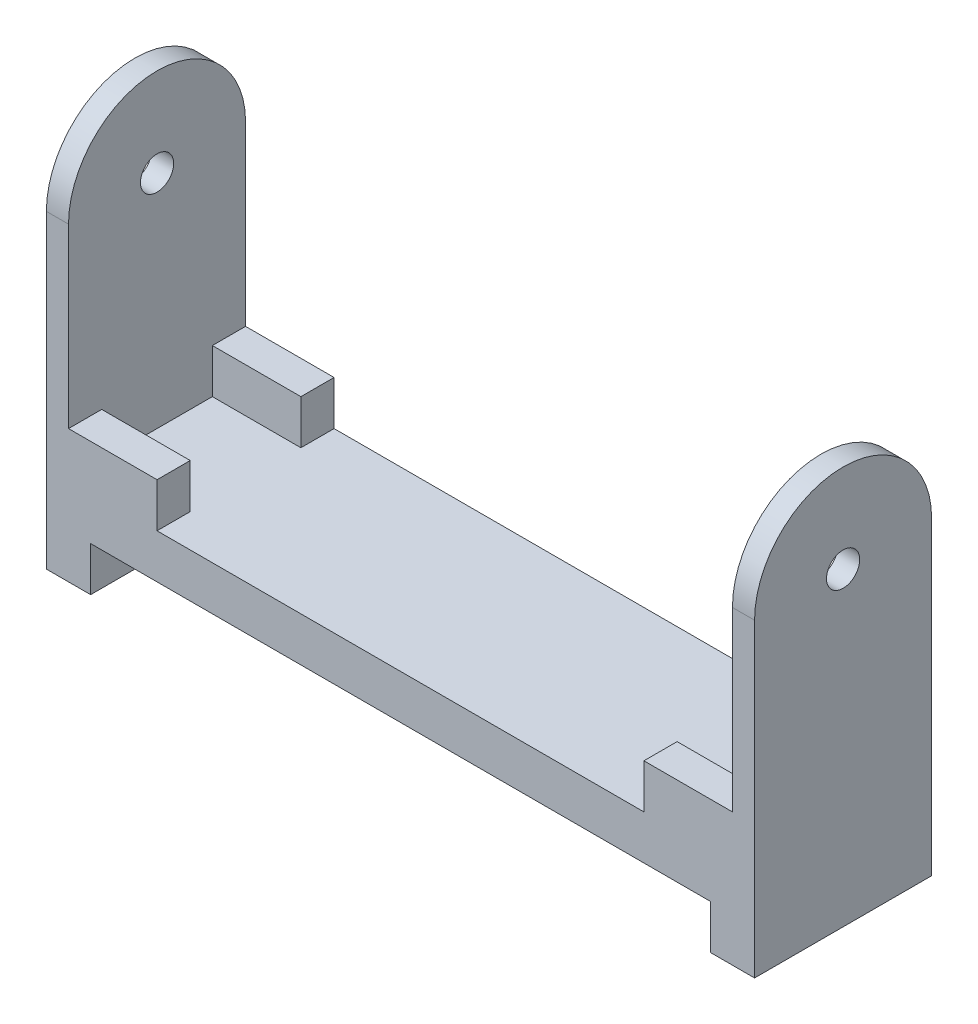
ISO-10303-21;
HEADER;
FILE_DESCRIPTION(('STEP AP214'),'2;1');
FILE_NAME('part.step','',(''),(''),'','','');
FILE_SCHEMA(('AUTOMOTIVE_DESIGN { 1 0 10303 214 1 1 1 1 }'));
ENDSEC;
DATA;
#1=APPLICATION_CONTEXT('core data for automotive mechanical design processes');
#2=APPLICATION_PROTOCOL_DEFINITION('international standard','automotive_design',2000,#1);
#3=PRODUCT_CONTEXT('',#1,'mechanical');
#4=PRODUCT('Part','Part','',(#3));
#5=PRODUCT_RELATED_PRODUCT_CATEGORY('part','',(#4));
#6=PRODUCT_DEFINITION_FORMATION('','',#4);
#7=PRODUCT_DEFINITION_CONTEXT('part definition',#1,'design');
#8=PRODUCT_DEFINITION('design','',#6,#7);
#9=PRODUCT_DEFINITION_SHAPE('','',#8);
#10=(LENGTH_UNIT() NAMED_UNIT(*) SI_UNIT(.MILLI.,.METRE.));
#11=(NAMED_UNIT(*) PLANE_ANGLE_UNIT() SI_UNIT($,.RADIAN.));
#12=(NAMED_UNIT(*) SI_UNIT($,.STERADIAN.) SOLID_ANGLE_UNIT());
#13=UNCERTAINTY_MEASURE_WITH_UNIT(LENGTH_MEASURE(1.E-05),#10,'distance_accuracy_value','');
#14=(GEOMETRIC_REPRESENTATION_CONTEXT(3) GLOBAL_UNCERTAINTY_ASSIGNED_CONTEXT((#13)) GLOBAL_UNIT_ASSIGNED_CONTEXT((#10,
#11,#12)) REPRESENTATION_CONTEXT('',''));
#15=CARTESIAN_POINT('',(0.,0.,0.));
#16=DIRECTION('',(0.,0.,1.));
#17=DIRECTION('',(1.,0.,0.));
#18=AXIS2_PLACEMENT_3D('',#15,#16,#17);
#19=CARTESIAN_POINT('',(310.,-100.,40.));
#20=DIRECTION('',(0.,-1.,0.));
#21=DIRECTION('',(0.,0.,-1.));
#22=AXIS2_PLACEMENT_3D('',#19,#20,#21);
#23=PLANE('',#22);
#24=DIRECTION('',(0.,0.,1.));
#25=VECTOR('',#24,1.);
#26=CARTESIAN_POINT('',(270.,-100.,-40.));
#27=LINE('',#26,#25);
#28=CARTESIAN_POINT('',(270.,-100.,-40.));
#29=VERTEX_POINT('',#28);
#30=CARTESIAN_POINT('',(270.,-100.,-25.));
#31=VERTEX_POINT('',#30);
#32=EDGE_CURVE('E284',#29,#31,#27,.T.);
#33=ORIENTED_EDGE('',*,*,#32,.F.);
#34=DIRECTION('',(-1.,0.,0.));
#35=VECTOR('',#34,1.);
#36=CARTESIAN_POINT('',(310.,-100.,-40.));
#37=LINE('',#36,#35);
#38=CARTESIAN_POINT('',(50.,-100.,-40.));
#39=VERTEX_POINT('',#38);
#40=EDGE_CURVE('E267',#29,#39,#37,.T.);
#41=ORIENTED_EDGE('',*,*,#40,.T.);
#42=DIRECTION('',(0.,0.,-1.));
#43=VECTOR('',#42,1.);
#44=CARTESIAN_POINT('',(50.,-100.,-40.));
#45=LINE('',#44,#43);
#46=CARTESIAN_POINT('',(50.,-100.,-25.));
#47=VERTEX_POINT('',#46);
#48=EDGE_CURVE('E359',#47,#39,#45,.T.);
#49=ORIENTED_EDGE('',*,*,#48,.F.);
#50=DIRECTION('',(1.,0.,0.));
#51=VECTOR('',#50,1.);
#52=CARTESIAN_POINT('',(10.,-100.,-25.));
#53=LINE('',#52,#51);
#54=CARTESIAN_POINT('',(10.,-100.,-25.));
#55=VERTEX_POINT('',#54);
#56=EDGE_CURVE('E353',#55,#47,#53,.T.);
#57=ORIENTED_EDGE('',*,*,#56,.F.);
#58=DIRECTION('',(0.,0.,-1.));
#59=VECTOR('',#58,1.);
#60=CARTESIAN_POINT('',(10.,-100.,40.));
#61=LINE('',#60,#59);
#62=CARTESIAN_POINT('',(10.,-100.,25.));
#63=VERTEX_POINT('',#62);
#64=EDGE_CURVE('E543',#63,#55,#61,.T.);
#65=ORIENTED_EDGE('',*,*,#64,.F.);
#66=DIRECTION('',(-1.,0.,0.));
#67=VECTOR('',#66,1.);
#68=CARTESIAN_POINT('',(10.,-100.,25.));
#69=LINE('',#68,#67);
#70=CARTESIAN_POINT('',(50.,-100.,25.));
#71=VERTEX_POINT('',#70);
#72=EDGE_CURVE('E328',#71,#63,#69,.T.);
#73=ORIENTED_EDGE('',*,*,#72,.F.);
#74=DIRECTION('',(0.,0.,-1.));
#75=VECTOR('',#74,1.);
#76=CARTESIAN_POINT('',(50.,-100.,40.));
#77=LINE('',#76,#75);
#78=CARTESIAN_POINT('',(50.,-100.,40.));
#79=VERTEX_POINT('',#78);
#80=EDGE_CURVE('E322',#79,#71,#77,.T.);
#81=ORIENTED_EDGE('',*,*,#80,.F.);
#82=DIRECTION('',(-1.,0.,0.));
#83=VECTOR('',#82,1.);
#84=CARTESIAN_POINT('',(310.,-100.,40.));
#85=LINE('',#84,#83);
#86=CARTESIAN_POINT('',(270.,-100.,40.));
#87=VERTEX_POINT('',#86);
#88=EDGE_CURVE('E529',#87,#79,#85,.T.);
#89=ORIENTED_EDGE('',*,*,#88,.F.);
#90=DIRECTION('',(0.,0.,1.));
#91=VECTOR('',#90,1.);
#92=CARTESIAN_POINT('',(270.,-100.,40.));
#93=LINE('',#92,#91);
#94=CARTESIAN_POINT('',(270.,-100.,25.));
#95=VERTEX_POINT('',#94);
#96=EDGE_CURVE('E298',#95,#87,#93,.T.);
#97=ORIENTED_EDGE('',*,*,#96,.F.);
#98=DIRECTION('',(-1.,0.,0.));
#99=VECTOR('',#98,1.);
#100=CARTESIAN_POINT('',(310.,-100.,25.));
#101=LINE('',#100,#99);
#102=CARTESIAN_POINT('',(310.,-100.,25.));
#103=VERTEX_POINT('',#102);
#104=EDGE_CURVE('E270',#103,#95,#101,.T.);
#105=ORIENTED_EDGE('',*,*,#104,.F.);
#106=DIRECTION('',(0.,0.,-1.));
#107=VECTOR('',#106,1.);
#108=CARTESIAN_POINT('',(310.,-100.,40.));
#109=LINE('',#108,#107);
#110=CARTESIAN_POINT('',(310.,-100.,-25.));
#111=VERTEX_POINT('',#110);
#112=EDGE_CURVE('E536',#103,#111,#109,.T.);
#113=ORIENTED_EDGE('',*,*,#112,.T.);
#114=DIRECTION('',(1.,0.,0.));
#115=VECTOR('',#114,1.);
#116=CARTESIAN_POINT('',(310.,-100.,-25.));
#117=LINE('',#116,#115);
#118=EDGE_CURVE('E57',#31,#111,#117,.T.);
#119=ORIENTED_EDGE('',*,*,#118,.F.);
#120=EDGE_LOOP('',(#33,#41,#49,#57,#65,#73,#81,#89,#97,#105,#113,#119));
#121=FACE_BOUND('',#120,.T.);
#122=ADVANCED_FACE('F39',(#121),#23,.F.);
#123=CARTESIAN_POINT('',(310.,40.,40.));
#124=DIRECTION('',(1.,0.,0.));
#125=DIRECTION('',(0.,0.,-1.));
#126=AXIS2_PLACEMENT_3D('',#123,#124,#125);
#127=PLANE('',#126);
#128=CARTESIAN_POINT('',(310.,0.,0.));
#129=DIRECTION('',(1.,0.,0.));
#130=DIRECTION('',(0.,0.,-1.));
#131=AXIS2_PLACEMENT_3D('',#128,#129,#130);
#132=CIRCLE('',#131,7.5);
#133=CARTESIAN_POINT('',(310.,0.,-7.5));
#134=VERTEX_POINT('',#133);
#135=EDGE_CURVE('E546',#134,#134,#132,.T.);
#136=ORIENTED_EDGE('',*,*,#135,.T.);
#137=EDGE_LOOP('',(#136));
#138=FACE_BOUND('',#137,.T.);
#139=DIRECTION('',(0.,-1.,0.));
#140=VECTOR('',#139,1.);
#141=CARTESIAN_POINT('',(310.,-80.,-25.));
#142=LINE('',#141,#140);
#143=CARTESIAN_POINT('',(310.,-80.,-25.));
#144=VERTEX_POINT('',#143);
#145=EDGE_CURVE('E280',#144,#111,#142,.T.);
#146=ORIENTED_EDGE('',*,*,#145,.T.);
#147=ORIENTED_EDGE('',*,*,#112,.F.);
#148=DIRECTION('',(0.,-1.,0.));
#149=VECTOR('',#148,1.);
#150=CARTESIAN_POINT('',(310.,-80.,25.));
#151=LINE('',#150,#149);
#152=CARTESIAN_POINT('',(310.,-80.,25.));
#153=VERTEX_POINT('',#152);
#154=EDGE_CURVE('E319',#153,#103,#151,.T.);
#155=ORIENTED_EDGE('',*,*,#154,.F.);
#156=DIRECTION('',(0.,0.,-1.));
#157=VECTOR('',#156,1.);
#158=CARTESIAN_POINT('',(310.,-80.,40.));
#159=LINE('',#158,#157);
#160=CARTESIAN_POINT('',(310.,-80.,40.));
#161=VERTEX_POINT('',#160);
#162=EDGE_CURVE('E293',#161,#153,#159,.T.);
#163=ORIENTED_EDGE('',*,*,#162,.F.);
#164=DIRECTION('',(0.,-1.,0.));
#165=VECTOR('',#164,1.);
#166=CARTESIAN_POINT('',(310.,40.,40.));
#167=LINE('',#166,#165);
#168=CARTESIAN_POINT('',(310.,0.,40.));
#169=VERTEX_POINT('',#168);
#170=EDGE_CURVE('E525',#169,#161,#167,.T.);
#171=ORIENTED_EDGE('',*,*,#170,.F.);
#172=CARTESIAN_POINT('',(310.,0.,0.));
#173=DIRECTION('',(1.,0.,0.));
#174=DIRECTION('',(0.,0.,-1.));
#175=AXIS2_PLACEMENT_3D('',#172,#173,#174);
#176=CIRCLE('',#175,40.);
#177=CARTESIAN_POINT('',(310.,0.,-40.));
#178=VERTEX_POINT('',#177);
#179=EDGE_CURVE('E549',#178,#169,#176,.T.);
#180=ORIENTED_EDGE('',*,*,#179,.F.);
#181=DIRECTION('',(0.,-1.,0.));
#182=VECTOR('',#181,1.);
#183=CARTESIAN_POINT('',(310.,40.,-40.));
#184=LINE('',#183,#182);
#185=CARTESIAN_POINT('',(310.,-80.,-40.));
#186=VERTEX_POINT('',#185);
#187=EDGE_CURVE('E524',#178,#186,#184,.T.);
#188=ORIENTED_EDGE('',*,*,#187,.T.);
#189=DIRECTION('',(0.,0.,-1.));
#190=VECTOR('',#189,1.);
#191=CARTESIAN_POINT('',(310.,-80.,-40.));
#192=LINE('',#191,#190);
#193=EDGE_CURVE('E65',#144,#186,#192,.T.);
#194=ORIENTED_EDGE('',*,*,#193,.F.);
#195=EDGE_LOOP('',(#146,#147,#155,#163,#171,#180,#188,#194));
#196=FACE_BOUND('',#195,.T.);
#197=ADVANCED_FACE('F599',(#138,#196),#127,.F.);
#198=CARTESIAN_POINT('',(10.,-100.,40.));
#199=DIRECTION('',(-1.,0.,0.));
#200=DIRECTION('',(0.,-1.,0.));
#201=AXIS2_PLACEMENT_3D('',#198,#199,#200);
#202=PLANE('',#201);
#203=CARTESIAN_POINT('',(10.,0.,0.));
#204=DIRECTION('',(-1.,0.,0.));
#205=DIRECTION('',(0.,-1.,0.));
#206=AXIS2_PLACEMENT_3D('',#203,#204,#205);
#207=CIRCLE('',#206,7.5);
#208=CARTESIAN_POINT('',(10.,-7.5,0.));
#209=VERTEX_POINT('',#208);
#210=EDGE_CURVE('E43',#209,#209,#207,.T.);
#211=ORIENTED_EDGE('',*,*,#210,.T.);
#212=EDGE_LOOP('',(#211));
#213=FACE_BOUND('',#212,.T.);
#214=DIRECTION('',(0.,-1.,0.));
#215=VECTOR('',#214,1.);
#216=CARTESIAN_POINT('',(10.,-80.,25.));
#217=LINE('',#216,#215);
#218=CARTESIAN_POINT('',(10.,-80.,25.));
#219=VERTEX_POINT('',#218);
#220=EDGE_CURVE('E337',#219,#63,#217,.T.);
#221=ORIENTED_EDGE('',*,*,#220,.T.);
#222=ORIENTED_EDGE('',*,*,#64,.T.);
#223=DIRECTION('',(0.,-1.,0.));
#224=VECTOR('',#223,1.);
#225=CARTESIAN_POINT('',(10.,-80.,-25.));
#226=LINE('',#225,#224);
#227=CARTESIAN_POINT('',(10.,-80.,-25.));
#228=VERTEX_POINT('',#227);
#229=EDGE_CURVE('E382',#228,#55,#226,.T.);
#230=ORIENTED_EDGE('',*,*,#229,.F.);
#231=DIRECTION('',(0.,0.,1.));
#232=VECTOR('',#231,1.);
#233=CARTESIAN_POINT('',(10.,-80.,-40.));
#234=LINE('',#233,#232);
#235=CARTESIAN_POINT('',(10.,-80.,-40.));
#236=VERTEX_POINT('',#235);
#237=EDGE_CURVE('E354',#236,#228,#234,.T.);
#238=ORIENTED_EDGE('',*,*,#237,.F.);
#239=DIRECTION('',(0.,1.,0.));
#240=VECTOR('',#239,1.);
#241=CARTESIAN_POINT('',(10.,-100.,-40.));
#242=LINE('',#241,#240);
#243=CARTESIAN_POINT('',(10.,0.,-40.));
#244=VERTEX_POINT('',#243);
#245=EDGE_CURVE('E530',#236,#244,#242,.T.);
#246=ORIENTED_EDGE('',*,*,#245,.T.);
#247=CARTESIAN_POINT('',(10.,0.,0.));
#248=DIRECTION('',(-1.,0.,0.));
#249=DIRECTION('',(0.,-1.,0.));
#250=AXIS2_PLACEMENT_3D('',#247,#248,#249);
#251=CIRCLE('',#250,40.);
#252=CARTESIAN_POINT('',(10.,0.,40.));
#253=VERTEX_POINT('',#252);
#254=EDGE_CURVE('E552',#253,#244,#251,.T.);
#255=ORIENTED_EDGE('',*,*,#254,.F.);
#256=DIRECTION('',(0.,1.,0.));
#257=VECTOR('',#256,1.);
#258=CARTESIAN_POINT('',(10.,-100.,40.));
#259=LINE('',#258,#257);
#260=CARTESIAN_POINT('',(10.,-80.,40.));
#261=VERTEX_POINT('',#260);
#262=EDGE_CURVE('E533',#261,#253,#259,.T.);
#263=ORIENTED_EDGE('',*,*,#262,.F.);
#264=DIRECTION('',(0.,0.,1.));
#265=VECTOR('',#264,1.);
#266=CARTESIAN_POINT('',(10.,-80.,40.));
#267=LINE('',#266,#265);
#268=EDGE_CURVE('E323',#219,#261,#267,.T.);
#269=ORIENTED_EDGE('',*,*,#268,.F.);
#270=EDGE_LOOP('',(#221,#222,#230,#238,#246,#255,#263,#269));
#271=FACE_BOUND('',#270,.T.);
#272=ADVANCED_FACE('F627',(#213,#271),#202,.F.);
#273=CARTESIAN_POINT('',(320.,-120.,40.));
#274=DIRECTION('',(0.,1.,0.));
#275=DIRECTION('',(0.,0.,1.));
#276=AXIS2_PLACEMENT_3D('',#273,#274,#275);
#277=PLANE('',#276);
#278=DIRECTION('',(0.,0.,-1.));
#279=VECTOR('',#278,1.);
#280=CARTESIAN_POINT('',(300.,-120.,-40.));
#281=LINE('',#280,#279);
#282=CARTESIAN_POINT('',(300.,-120.,40.));
#283=VERTEX_POINT('',#282);
#284=CARTESIAN_POINT('',(300.,-120.,-40.));
#285=VERTEX_POINT('',#284);
#286=EDGE_CURVE('E423',#283,#285,#281,.T.);
#287=ORIENTED_EDGE('',*,*,#286,.F.);
#288=DIRECTION('',(-1.,0.,0.));
#289=VECTOR('',#288,1.);
#290=CARTESIAN_POINT('',(320.,-120.,40.));
#291=LINE('',#290,#289);
#292=CARTESIAN_POINT('',(20.,-120.,40.));
#293=VERTEX_POINT('',#292);
#294=EDGE_CURVE('E593',#283,#293,#291,.T.);
#295=ORIENTED_EDGE('',*,*,#294,.T.);
#296=DIRECTION('',(0.,0.,1.));
#297=VECTOR('',#296,1.);
#298=CARTESIAN_POINT('',(20.,-120.,40.));
#299=LINE('',#298,#297);
#300=CARTESIAN_POINT('',(20.,-120.,-40.));
#301=VERTEX_POINT('',#300);
#302=EDGE_CURVE('E498',#301,#293,#299,.T.);
#303=ORIENTED_EDGE('',*,*,#302,.F.);
#304=DIRECTION('',(-1.,0.,0.));
#305=VECTOR('',#304,1.);
#306=CARTESIAN_POINT('',(320.,-120.,-40.));
#307=LINE('',#306,#305);
#308=EDGE_CURVE('E590',#285,#301,#307,.T.);
#309=ORIENTED_EDGE('',*,*,#308,.F.);
#310=EDGE_LOOP('',(#287,#295,#303,#309));
#311=FACE_BOUND('',#310,.T.);
#312=ADVANCED_FACE('F632',(#311),#277,.F.);
#313=CARTESIAN_POINT('',(320.,0.,0.));
#314=DIRECTION('',(-1.,0.,0.));
#315=DIRECTION('',(0.,0.,1.));
#316=AXIS2_PLACEMENT_3D('',#313,#314,#315);
#317=CYLINDRICAL_SURFACE('',#316,40.);
#318=DIRECTION('',(-1.,0.,0.));
#319=VECTOR('',#318,1.);
#320=CARTESIAN_POINT('',(320.,0.,40.));
#321=LINE('',#320,#319);
#322=CARTESIAN_POINT('',(0.,0.,40.));
#323=VERTEX_POINT('',#322);
#324=EDGE_CURVE('E49',#253,#323,#321,.T.);
#325=ORIENTED_EDGE('',*,*,#324,.F.);
#326=ORIENTED_EDGE('',*,*,#254,.T.);
#327=DIRECTION('',(-1.,0.,0.));
#328=VECTOR('',#327,1.);
#329=CARTESIAN_POINT('',(320.,0.,-40.));
#330=LINE('',#329,#328);
#331=CARTESIAN_POINT('',(0.,0.,-40.));
#332=VERTEX_POINT('',#331);
#333=EDGE_CURVE('E576',#244,#332,#330,.T.);
#334=ORIENTED_EDGE('',*,*,#333,.T.);
#335=CARTESIAN_POINT('',(0.,0.,0.));
#336=DIRECTION('',(1.,0.,0.));
#337=DIRECTION('',(0.,0.,-1.));
#338=AXIS2_PLACEMENT_3D('',#335,#336,#337);
#339=CIRCLE('',#338,40.);
#340=EDGE_CURVE('E561',#332,#323,#339,.T.);
#341=ORIENTED_EDGE('',*,*,#340,.T.);
#342=EDGE_LOOP('',(#325,#326,#334,#341));
#343=FACE_BOUND('',#342,.T.);
#344=ADVANCED_FACE('F620',(#343),#317,.T.);
#345=CARTESIAN_POINT('',(320.,0.,0.));
#346=DIRECTION('',(-1.,0.,0.));
#347=DIRECTION('',(0.,0.,1.));
#348=AXIS2_PLACEMENT_3D('',#345,#346,#347);
#349=CYLINDRICAL_SURFACE('',#348,7.5);
#350=ORIENTED_EDGE('',*,*,#210,.F.);
#351=EDGE_LOOP('',(#350));
#352=FACE_BOUND('',#351,.T.);
#353=CARTESIAN_POINT('',(0.,0.,0.));
#354=DIRECTION('',(1.,0.,0.));
#355=DIRECTION('',(0.,0.,-1.));
#356=AXIS2_PLACEMENT_3D('',#353,#354,#355);
#357=CIRCLE('',#356,7.5);
#358=CARTESIAN_POINT('',(0.,0.,-7.5));
#359=VERTEX_POINT('',#358);
#360=EDGE_CURVE('E556',#359,#359,#357,.T.);
#361=ORIENTED_EDGE('',*,*,#360,.F.);
#362=EDGE_LOOP('',(#361));
#363=FACE_BOUND('',#362,.T.);
#364=ADVANCED_FACE('F606',(#352,#363),#349,.F.);
#365=CARTESIAN_POINT('',(320.,0.,0.));
#366=DIRECTION('',(1.,0.,0.));
#367=DIRECTION('',(0.,0.,-1.));
#368=AXIS2_PLACEMENT_3D('',#365,#366,#367);
#369=PLANE('',#368);
#370=CARTESIAN_POINT('',(320.,0.,0.));
#371=DIRECTION('',(1.,0.,0.));
#372=DIRECTION('',(0.,0.,-1.));
#373=AXIS2_PLACEMENT_3D('',#370,#371,#372);
#374=CIRCLE('',#373,40.);
#375=CARTESIAN_POINT('',(320.,0.,-40.));
#376=VERTEX_POINT('',#375);
#377=CARTESIAN_POINT('',(320.,0.,40.));
#378=VERTEX_POINT('',#377);
#379=EDGE_CURVE('E565',#376,#378,#374,.T.);
#380=ORIENTED_EDGE('',*,*,#379,.T.);
#381=DIRECTION('',(0.,-1.,0.));
#382=VECTOR('',#381,1.);
#383=CARTESIAN_POINT('',(320.,0.,40.));
#384=LINE('',#383,#382);
#385=CARTESIAN_POINT('',(320.,-140.,40.));
#386=VERTEX_POINT('',#385);
#387=EDGE_CURVE('E569',#378,#386,#384,.T.);
#388=ORIENTED_EDGE('',*,*,#387,.T.);
#389=DIRECTION('',(0.,0.,1.));
#390=VECTOR('',#389,1.);
#391=CARTESIAN_POINT('',(320.,-140.,-40.));
#392=LINE('',#391,#390);
#393=CARTESIAN_POINT('',(320.,-140.,-40.));
#394=VERTEX_POINT('',#393);
#395=EDGE_CURVE('E475',#394,#386,#392,.T.);
#396=ORIENTED_EDGE('',*,*,#395,.F.);
#397=DIRECTION('',(0.,1.,0.));
#398=VECTOR('',#397,1.);
#399=CARTESIAN_POINT('',(320.,-120.,-40.));
#400=LINE('',#399,#398);
#401=EDGE_CURVE('E573',#394,#376,#400,.T.);
#402=ORIENTED_EDGE('',*,*,#401,.T.);
#403=EDGE_LOOP('',(#380,#388,#396,#402));
#404=FACE_BOUND('',#403,.T.);
#405=CARTESIAN_POINT('',(320.,0.,0.));
#406=DIRECTION('',(1.,0.,0.));
#407=DIRECTION('',(0.,0.,-1.));
#408=AXIS2_PLACEMENT_3D('',#405,#406,#407);
#409=CIRCLE('',#408,7.5);
#410=CARTESIAN_POINT('',(320.,0.,-7.5));
#411=VERTEX_POINT('',#410);
#412=EDGE_CURVE('E557',#411,#411,#409,.T.);
#413=ORIENTED_EDGE('',*,*,#412,.F.);
#414=EDGE_LOOP('',(#413));
#415=FACE_BOUND('',#414,.T.);
#416=ADVANCED_FACE('F609',(#404,#415),#369,.T.);
#417=CARTESIAN_POINT('',(0.,0.,0.));
#418=DIRECTION('',(1.,0.,0.));
#419=DIRECTION('',(0.,0.,-1.));
#420=AXIS2_PLACEMENT_3D('',#417,#418,#419);
#421=PLANE('',#420);
#422=ORIENTED_EDGE('',*,*,#340,.F.);
#423=DIRECTION('',(0.,1.,0.));
#424=VECTOR('',#423,1.);
#425=CARTESIAN_POINT('',(0.,-120.,-40.));
#426=LINE('',#425,#424);
#427=CARTESIAN_POINT('',(0.,-140.,-40.0000000000001));
#428=VERTEX_POINT('',#427);
#429=EDGE_CURVE('E570',#428,#332,#426,.T.);
#430=ORIENTED_EDGE('',*,*,#429,.F.);
#431=DIRECTION('',(0.,0.,-1.));
#432=VECTOR('',#431,1.);
#433=CARTESIAN_POINT('',(0.,-140.,40.));
#434=LINE('',#433,#432);
#435=CARTESIAN_POINT('',(0.,-140.,40.));
#436=VERTEX_POINT('',#435);
#437=EDGE_CURVE('E499',#436,#428,#434,.T.);
#438=ORIENTED_EDGE('',*,*,#437,.F.);
#439=DIRECTION('',(0.,-1.,0.));
#440=VECTOR('',#439,1.);
#441=CARTESIAN_POINT('',(0.,0.,40.));
#442=LINE('',#441,#440);
#443=EDGE_CURVE('E580',#323,#436,#442,.T.);
#444=ORIENTED_EDGE('',*,*,#443,.F.);
#445=EDGE_LOOP('',(#422,#430,#438,#444));
#446=FACE_BOUND('',#445,.T.);
#447=ORIENTED_EDGE('',*,*,#360,.T.);
#448=EDGE_LOOP('',(#447));
#449=FACE_BOUND('',#448,.T.);
#450=ADVANCED_FACE('F611',(#446,#449),#421,.F.);
#451=EDGE_CURVE('E586',#376,#178,#330,.T.);
#452=ORIENTED_EDGE('',*,*,#451,.T.);
#453=ORIENTED_EDGE('',*,*,#179,.T.);
#454=EDGE_CURVE('E11',#378,#169,#321,.T.);
#455=ORIENTED_EDGE('',*,*,#454,.F.);
#456=ORIENTED_EDGE('',*,*,#379,.F.);
#457=EDGE_LOOP('',(#452,#453,#455,#456));
#458=FACE_BOUND('',#457,.T.);
#459=ADVANCED_FACE('F41',(#458),#317,.T.);
#460=CARTESIAN_POINT('',(320.,0.,40.));
#461=DIRECTION('',(0.,0.,-1.));
#462=DIRECTION('',(0.,1.,0.));
#463=AXIS2_PLACEMENT_3D('',#460,#461,#462);
#464=PLANE('',#463);
#465=DIRECTION('',(0.,-1.,0.));
#466=VECTOR('',#465,1.);
#467=CARTESIAN_POINT('',(270.,-80.,40.));
#468=LINE('',#467,#466);
#469=CARTESIAN_POINT('',(270.,-80.,40.));
#470=VERTEX_POINT('',#469);
#471=EDGE_CURVE('E307',#470,#87,#468,.T.);
#472=ORIENTED_EDGE('',*,*,#471,.T.);
#473=ORIENTED_EDGE('',*,*,#88,.T.);
#474=DIRECTION('',(0.,-1.,0.));
#475=VECTOR('',#474,1.);
#476=CARTESIAN_POINT('',(50.,-80.,40.));
#477=LINE('',#476,#475);
#478=CARTESIAN_POINT('',(50.,-80.,40.));
#479=VERTEX_POINT('',#478);
#480=EDGE_CURVE('E349',#479,#79,#477,.T.);
#481=ORIENTED_EDGE('',*,*,#480,.F.);
#482=DIRECTION('',(1.,0.,0.));
#483=VECTOR('',#482,1.);
#484=CARTESIAN_POINT('',(10.,-80.,40.));
#485=LINE('',#484,#483);
#486=EDGE_CURVE('E327',#261,#479,#485,.T.);
#487=ORIENTED_EDGE('',*,*,#486,.F.);
#488=ORIENTED_EDGE('',*,*,#262,.T.);
#489=ORIENTED_EDGE('',*,*,#324,.T.);
#490=ORIENTED_EDGE('',*,*,#443,.T.);
#491=DIRECTION('',(-1.,0.,0.));
#492=VECTOR('',#491,1.);
#493=CARTESIAN_POINT('',(0.,-140.,40.));
#494=LINE('',#493,#492);
#495=CARTESIAN_POINT('',(20.,-140.,40.));
#496=VERTEX_POINT('',#495);
#497=EDGE_CURVE('E509',#496,#436,#494,.T.);
#498=ORIENTED_EDGE('',*,*,#497,.F.);
#499=DIRECTION('',(0.,1.,0.));
#500=VECTOR('',#499,1.);
#501=CARTESIAN_POINT('',(20.,-140.,40.));
#502=LINE('',#501,#500);
#503=EDGE_CURVE('E513',#496,#293,#502,.T.);
#504=ORIENTED_EDGE('',*,*,#503,.T.);
#505=ORIENTED_EDGE('',*,*,#294,.F.);
#506=DIRECTION('',(0.,1.,0.));
#507=VECTOR('',#506,1.);
#508=CARTESIAN_POINT('',(300.,-140.,40.));
#509=LINE('',#508,#507);
#510=CARTESIAN_POINT('',(300.,-140.,40.));
#511=VERTEX_POINT('',#510);
#512=EDGE_CURVE('E495',#511,#283,#509,.T.);
#513=ORIENTED_EDGE('',*,*,#512,.F.);
#514=DIRECTION('',(-1.,0.,0.));
#515=VECTOR('',#514,1.);
#516=CARTESIAN_POINT('',(320.,-140.,40.));
#517=LINE('',#516,#515);
#518=EDGE_CURVE('E479',#386,#511,#517,.T.);
#519=ORIENTED_EDGE('',*,*,#518,.F.);
#520=ORIENTED_EDGE('',*,*,#387,.F.);
#521=ORIENTED_EDGE('',*,*,#454,.T.);
#522=ORIENTED_EDGE('',*,*,#170,.T.);
#523=DIRECTION('',(1.,0.,0.));
#524=VECTOR('',#523,1.);
#525=CARTESIAN_POINT('',(310.,-80.,40.));
#526=LINE('',#525,#524);
#527=EDGE_CURVE('E304',#470,#161,#526,.T.);
#528=ORIENTED_EDGE('',*,*,#527,.F.);
#529=EDGE_LOOP('',(#472,#473,#481,#487,#488,#489,#490,#498,#504,#505,#513,#519,#520,#521,#522,#528));
#530=FACE_BOUND('',#529,.T.);
#531=ADVANCED_FACE('F847',(#530),#464,.F.);
#532=CARTESIAN_POINT('',(320.,-120.,-40.));
#533=DIRECTION('',(0.,0.,1.));
#534=DIRECTION('',(0.,-1.,0.));
#535=AXIS2_PLACEMENT_3D('',#532,#533,#534);
#536=PLANE('',#535);
#537=ORIENTED_EDGE('',*,*,#245,.F.);
#538=DIRECTION('',(-1.,0.,0.));
#539=VECTOR('',#538,1.);
#540=CARTESIAN_POINT('',(10.,-80.,-40.));
#541=LINE('',#540,#539);
#542=CARTESIAN_POINT('',(50.,-80.,-40.));
#543=VERTEX_POINT('',#542);
#544=EDGE_CURVE('E365',#543,#236,#541,.T.);
#545=ORIENTED_EDGE('',*,*,#544,.F.);
#546=DIRECTION('',(0.,-1.,0.));
#547=VECTOR('',#546,1.);
#548=CARTESIAN_POINT('',(50.,-80.,-40.));
#549=LINE('',#548,#547);
#550=EDGE_CURVE('E369',#543,#39,#549,.T.);
#551=ORIENTED_EDGE('',*,*,#550,.T.);
#552=ORIENTED_EDGE('',*,*,#40,.F.);
#553=DIRECTION('',(0.,-1.,0.));
#554=VECTOR('',#553,1.);
#555=CARTESIAN_POINT('',(270.,-80.,-40.));
#556=LINE('',#555,#554);
#557=CARTESIAN_POINT('',(270.,-80.,-40.));
#558=VERTEX_POINT('',#557);
#559=EDGE_CURVE('E263',#558,#29,#556,.T.);
#560=ORIENTED_EDGE('',*,*,#559,.F.);
#561=DIRECTION('',(-1.,0.,0.));
#562=VECTOR('',#561,1.);
#563=CARTESIAN_POINT('',(310.,-80.,-40.));
#564=LINE('',#563,#562);
#565=EDGE_CURVE('E252',#186,#558,#564,.T.);
#566=ORIENTED_EDGE('',*,*,#565,.F.);
#567=ORIENTED_EDGE('',*,*,#187,.F.);
#568=ORIENTED_EDGE('',*,*,#451,.F.);
#569=ORIENTED_EDGE('',*,*,#401,.F.);
#570=DIRECTION('',(1.,0.,0.));
#571=VECTOR('',#570,1.);
#572=CARTESIAN_POINT('',(320.,-140.,-40.));
#573=LINE('',#572,#571);
#574=CARTESIAN_POINT('',(300.,-140.,-40.));
#575=VERTEX_POINT('',#574);
#576=EDGE_CURVE('E485',#575,#394,#573,.T.);
#577=ORIENTED_EDGE('',*,*,#576,.F.);
#578=DIRECTION('',(0.,1.,0.));
#579=VECTOR('',#578,1.);
#580=CARTESIAN_POINT('',(300.,-140.,-40.));
#581=LINE('',#580,#579);
#582=EDGE_CURVE('E489',#575,#285,#581,.T.);
#583=ORIENTED_EDGE('',*,*,#582,.T.);
#584=ORIENTED_EDGE('',*,*,#308,.T.);
#585=DIRECTION('',(0.,1.,0.));
#586=VECTOR('',#585,1.);
#587=CARTESIAN_POINT('',(20.,-140.,-40.0000000000001));
#588=LINE('',#587,#586);
#589=CARTESIAN_POINT('',(20.,-140.,-40.0000000000001));
#590=VERTEX_POINT('',#589);
#591=EDGE_CURVE('E520',#590,#301,#588,.T.);
#592=ORIENTED_EDGE('',*,*,#591,.F.);
#593=DIRECTION('',(1.,0.,0.));
#594=VECTOR('',#593,1.);
#595=CARTESIAN_POINT('',(0.,-140.,-40.0000000000001));
#596=LINE('',#595,#594);
#597=EDGE_CURVE('E503',#428,#590,#596,.T.);
#598=ORIENTED_EDGE('',*,*,#597,.F.);
#599=ORIENTED_EDGE('',*,*,#429,.T.);
#600=ORIENTED_EDGE('',*,*,#333,.F.);
#601=EDGE_LOOP('',(#537,#545,#551,#552,#560,#566,#567,#568,#569,#577,#583,#584,#592,#598,#599,#600));
#602=FACE_BOUND('',#601,.T.);
#603=ADVANCED_FACE('F265',(#602),#536,.F.);
#604=ORIENTED_EDGE('',*,*,#135,.F.);
#605=EDGE_LOOP('',(#604));
#606=FACE_BOUND('',#605,.T.);
#607=ORIENTED_EDGE('',*,*,#412,.T.);
#608=EDGE_LOOP('',(#607));
#609=FACE_BOUND('',#608,.T.);
#610=ADVANCED_FACE('F601',(#606,#609),#349,.F.);
#611=CARTESIAN_POINT('',(20.,-140.,40.));
#612=DIRECTION('',(-1.,0.,0.));
#613=DIRECTION('',(0.,0.,1.));
#614=AXIS2_PLACEMENT_3D('',#611,#612,#613);
#615=PLANE('',#614);
#616=ORIENTED_EDGE('',*,*,#302,.T.);
#617=ORIENTED_EDGE('',*,*,#503,.F.);
#618=DIRECTION('',(0.,0.,1.));
#619=VECTOR('',#618,1.);
#620=CARTESIAN_POINT('',(20.,-140.,40.));
#621=LINE('',#620,#619);
#622=EDGE_CURVE('E506',#590,#496,#621,.T.);
#623=ORIENTED_EDGE('',*,*,#622,.F.);
#624=ORIENTED_EDGE('',*,*,#591,.T.);
#625=EDGE_LOOP('',(#616,#617,#623,#624));
#626=FACE_BOUND('',#625,.T.);
#627=ADVANCED_FACE('F604',(#626),#615,.F.);
#628=CARTESIAN_POINT('',(0.,-140.,0.));
#629=DIRECTION('',(0.,-1.,0.));
#630=DIRECTION('',(0.,0.,-1.));
#631=AXIS2_PLACEMENT_3D('',#628,#629,#630);
#632=PLANE('',#631);
#633=DIRECTION('',(0.,0.,-1.));
#634=VECTOR('',#633,1.);
#635=CARTESIAN_POINT('',(5.00000000000001,-140.,-5.00000000000005));
#636=LINE('',#635,#634);
#637=CARTESIAN_POINT('',(5.00000000000001,-140.,4.99999999999995));
#638=VERTEX_POINT('',#637);
#639=CARTESIAN_POINT('',(5.00000000000001,-140.,-5.00000000000005));
#640=VERTEX_POINT('',#639);
#641=EDGE_CURVE('E405',#638,#640,#636,.T.);
#642=ORIENTED_EDGE('',*,*,#641,.F.);
#643=DIRECTION('',(-1.,0.,0.));
#644=VECTOR('',#643,1.);
#645=CARTESIAN_POINT('',(15.,-140.,4.99999999999995));
#646=LINE('',#645,#644);
#647=CARTESIAN_POINT('',(15.,-140.,4.99999999999995));
#648=VERTEX_POINT('',#647);
#649=EDGE_CURVE('E392',#648,#638,#646,.T.);
#650=ORIENTED_EDGE('',*,*,#649,.F.);
#651=DIRECTION('',(0.,0.,1.));
#652=VECTOR('',#651,1.);
#653=CARTESIAN_POINT('',(15.,-140.,-5.00000000000005));
#654=LINE('',#653,#652);
#655=CARTESIAN_POINT('',(15.,-140.,-5.00000000000005));
#656=VERTEX_POINT('',#655);
#657=EDGE_CURVE('E413',#656,#648,#654,.T.);
#658=ORIENTED_EDGE('',*,*,#657,.F.);
#659=DIRECTION('',(1.,0.,0.));
#660=VECTOR('',#659,1.);
#661=CARTESIAN_POINT('',(15.,-140.,-5.00000000000005));
#662=LINE('',#661,#660);
#663=EDGE_CURVE('E408',#640,#656,#662,.T.);
#664=ORIENTED_EDGE('',*,*,#663,.F.);
#665=EDGE_LOOP('',(#642,#650,#658,#664));
#666=FACE_BOUND('',#665,.T.);
#667=ORIENTED_EDGE('',*,*,#437,.T.);
#668=ORIENTED_EDGE('',*,*,#597,.T.);
#669=ORIENTED_EDGE('',*,*,#622,.T.);
#670=ORIENTED_EDGE('',*,*,#497,.T.);
#671=EDGE_LOOP('',(#667,#668,#669,#670));
#672=FACE_BOUND('',#671,.T.);
#673=ADVANCED_FACE('F636',(#666,#672),#632,.T.);
#674=CARTESIAN_POINT('',(300.,-140.,-40.));
#675=DIRECTION('',(1.,0.,0.));
#676=DIRECTION('',(0.,0.,-1.));
#677=AXIS2_PLACEMENT_3D('',#674,#675,#676);
#678=PLANE('',#677);
#679=ORIENTED_EDGE('',*,*,#286,.T.);
#680=ORIENTED_EDGE('',*,*,#582,.F.);
#681=DIRECTION('',(0.,0.,-1.));
#682=VECTOR('',#681,1.);
#683=CARTESIAN_POINT('',(300.,-140.,-40.));
#684=LINE('',#683,#682);
#685=EDGE_CURVE('E482',#511,#575,#684,.T.);
#686=ORIENTED_EDGE('',*,*,#685,.F.);
#687=ORIENTED_EDGE('',*,*,#512,.T.);
#688=EDGE_LOOP('',(#679,#680,#686,#687));
#689=FACE_BOUND('',#688,.T.);
#690=ADVANCED_FACE('F640',(#689),#678,.F.);
#691=CARTESIAN_POINT('',(0.,-140.,0.));
#692=DIRECTION('',(0.,-1.,0.));
#693=DIRECTION('',(0.,0.,-1.));
#694=AXIS2_PLACEMENT_3D('',#691,#692,#693);
#695=PLANE('',#694);
#696=DIRECTION('',(0.,0.,-1.));
#697=VECTOR('',#696,1.);
#698=CARTESIAN_POINT('',(305.,-140.,-5.));
#699=LINE('',#698,#697);
#700=CARTESIAN_POINT('',(305.,-140.,5.));
#701=VERTEX_POINT('',#700);
#702=CARTESIAN_POINT('',(305.,-140.,-5.));
#703=VERTEX_POINT('',#702);
#704=EDGE_CURVE('E386',#701,#703,#699,.T.);
#705=ORIENTED_EDGE('',*,*,#704,.F.);
#706=DIRECTION('',(-1.,0.,0.));
#707=VECTOR('',#706,1.);
#708=CARTESIAN_POINT('',(315.,-140.,5.));
#709=LINE('',#708,#707);
#710=CARTESIAN_POINT('',(315.,-140.,5.));
#711=VERTEX_POINT('',#710);
#712=EDGE_CURVE('E438',#711,#701,#709,.T.);
#713=ORIENTED_EDGE('',*,*,#712,.F.);
#714=DIRECTION('',(0.,0.,1.));
#715=VECTOR('',#714,1.);
#716=CARTESIAN_POINT('',(315.,-140.,-5.));
#717=LINE('',#716,#715);
#718=CARTESIAN_POINT('',(315.,-140.,-5.));
#719=VERTEX_POINT('',#718);
#720=EDGE_CURVE('E457',#719,#711,#717,.T.);
#721=ORIENTED_EDGE('',*,*,#720,.F.);
#722=DIRECTION('',(1.,0.,0.));
#723=VECTOR('',#722,1.);
#724=CARTESIAN_POINT('',(315.,-140.,-5.));
#725=LINE('',#724,#723);
#726=EDGE_CURVE('E453',#703,#719,#725,.T.);
#727=ORIENTED_EDGE('',*,*,#726,.F.);
#728=EDGE_LOOP('',(#705,#713,#721,#727));
#729=FACE_BOUND('',#728,.T.);
#730=ORIENTED_EDGE('',*,*,#395,.T.);
#731=ORIENTED_EDGE('',*,*,#518,.T.);
#732=ORIENTED_EDGE('',*,*,#685,.T.);
#733=ORIENTED_EDGE('',*,*,#576,.T.);
#734=EDGE_LOOP('',(#730,#731,#732,#733));
#735=FACE_BOUND('',#734,.T.);
#736=ADVANCED_FACE('F644',(#729,#735),#695,.T.);
#737=CARTESIAN_POINT('',(305.,-110.,-5.));
#738=DIRECTION('',(-1.,0.,0.));
#739=DIRECTION('',(0.,0.,1.));
#740=AXIS2_PLACEMENT_3D('',#737,#738,#739);
#741=PLANE('',#740);
#742=ORIENTED_EDGE('',*,*,#704,.T.);
#743=DIRECTION('',(0.,-1.,0.));
#744=VECTOR('',#743,1.);
#745=CARTESIAN_POINT('',(305.,-110.,-5.));
#746=LINE('',#745,#744);
#747=CARTESIAN_POINT('',(305.,-110.,-5.));
#748=VERTEX_POINT('',#747);
#749=EDGE_CURVE('E450',#748,#703,#746,.T.);
#750=ORIENTED_EDGE('',*,*,#749,.F.);
#751=DIRECTION('',(0.,0.,-1.));
#752=VECTOR('',#751,1.);
#753=CARTESIAN_POINT('',(305.,-110.,-5.));
#754=LINE('',#753,#752);
#755=CARTESIAN_POINT('',(305.,-110.,5.));
#756=VERTEX_POINT('',#755);
#757=EDGE_CURVE('E433',#756,#748,#754,.T.);
#758=ORIENTED_EDGE('',*,*,#757,.F.);
#759=DIRECTION('',(0.,-1.,0.));
#760=VECTOR('',#759,1.);
#761=CARTESIAN_POINT('',(305.,-110.,5.));
#762=LINE('',#761,#760);
#763=EDGE_CURVE('E409',#756,#701,#762,.T.);
#764=ORIENTED_EDGE('',*,*,#763,.T.);
#765=EDGE_LOOP('',(#742,#750,#758,#764));
#766=FACE_BOUND('',#765,.T.);
#767=ADVANCED_FACE('F648',(#766),#741,.F.);
#768=CARTESIAN_POINT('',(315.,-110.,5.));
#769=DIRECTION('',(0.,0.,1.));
#770=DIRECTION('',(1.,0.,0.));
#771=AXIS2_PLACEMENT_3D('',#768,#769,#770);
#772=PLANE('',#771);
#773=ORIENTED_EDGE('',*,*,#712,.T.);
#774=ORIENTED_EDGE('',*,*,#763,.F.);
#775=DIRECTION('',(-1.,0.,0.));
#776=VECTOR('',#775,1.);
#777=CARTESIAN_POINT('',(315.,-110.,5.));
#778=LINE('',#777,#776);
#779=CARTESIAN_POINT('',(315.,-110.,5.));
#780=VERTEX_POINT('',#779);
#781=EDGE_CURVE('E446',#780,#756,#778,.T.);
#782=ORIENTED_EDGE('',*,*,#781,.F.);
#783=DIRECTION('',(0.,-1.,0.));
#784=VECTOR('',#783,1.);
#785=CARTESIAN_POINT('',(315.,-110.,5.));
#786=LINE('',#785,#784);
#787=EDGE_CURVE('E466',#780,#711,#786,.T.);
#788=ORIENTED_EDGE('',*,*,#787,.T.);
#789=EDGE_LOOP('',(#773,#774,#782,#788));
#790=FACE_BOUND('',#789,.T.);
#791=ADVANCED_FACE('F652',(#790),#772,.F.);
#792=CARTESIAN_POINT('',(315.,-110.,-5.));
#793=DIRECTION('',(1.,0.,0.));
#794=DIRECTION('',(0.,0.,-1.));
#795=AXIS2_PLACEMENT_3D('',#792,#793,#794);
#796=PLANE('',#795);
#797=ORIENTED_EDGE('',*,*,#720,.T.);
#798=ORIENTED_EDGE('',*,*,#787,.F.);
#799=DIRECTION('',(0.,0.,1.));
#800=VECTOR('',#799,1.);
#801=CARTESIAN_POINT('',(315.,-110.,-5.));
#802=LINE('',#801,#800);
#803=CARTESIAN_POINT('',(315.,-110.,-5.));
#804=VERTEX_POINT('',#803);
#805=EDGE_CURVE('E442',#804,#780,#802,.T.);
#806=ORIENTED_EDGE('',*,*,#805,.F.);
#807=DIRECTION('',(0.,-1.,0.));
#808=VECTOR('',#807,1.);
#809=CARTESIAN_POINT('',(315.,-110.,-5.));
#810=LINE('',#809,#808);
#811=EDGE_CURVE('E469',#804,#719,#810,.T.);
#812=ORIENTED_EDGE('',*,*,#811,.T.);
#813=EDGE_LOOP('',(#797,#798,#806,#812));
#814=FACE_BOUND('',#813,.T.);
#815=ADVANCED_FACE('F658',(#814),#796,.F.);
#816=CARTESIAN_POINT('',(315.,-110.,-5.));
#817=DIRECTION('',(0.,0.,-1.));
#818=DIRECTION('',(-1.,0.,0.));
#819=AXIS2_PLACEMENT_3D('',#816,#817,#818);
#820=PLANE('',#819);
#821=ORIENTED_EDGE('',*,*,#726,.T.);
#822=ORIENTED_EDGE('',*,*,#811,.F.);
#823=DIRECTION('',(1.,0.,0.));
#824=VECTOR('',#823,1.);
#825=CARTESIAN_POINT('',(315.,-110.,-5.));
#826=LINE('',#825,#824);
#827=EDGE_CURVE('E437',#748,#804,#826,.T.);
#828=ORIENTED_EDGE('',*,*,#827,.F.);
#829=ORIENTED_EDGE('',*,*,#749,.T.);
#830=EDGE_LOOP('',(#821,#822,#828,#829));
#831=FACE_BOUND('',#830,.T.);
#832=ADVANCED_FACE('F654',(#831),#820,.F.);
#833=CARTESIAN_POINT('',(0.,-110.,0.));
#834=DIRECTION('',(0.,-1.,0.));
#835=DIRECTION('',(0.,0.,-1.));
#836=AXIS2_PLACEMENT_3D('',#833,#834,#835);
#837=PLANE('',#836);
#838=ORIENTED_EDGE('',*,*,#757,.T.);
#839=ORIENTED_EDGE('',*,*,#827,.T.);
#840=ORIENTED_EDGE('',*,*,#805,.T.);
#841=ORIENTED_EDGE('',*,*,#781,.T.);
#842=EDGE_LOOP('',(#838,#839,#840,#841));
#843=FACE_BOUND('',#842,.T.);
#844=ADVANCED_FACE('F657',(#843),#837,.T.);
#845=CARTESIAN_POINT('',(5.00000000000001,-110.,-5.00000000000005));
#846=DIRECTION('',(-1.,0.,0.));
#847=DIRECTION('',(0.,0.,1.));
#848=AXIS2_PLACEMENT_3D('',#845,#846,#847);
#849=PLANE('',#848);
#850=ORIENTED_EDGE('',*,*,#641,.T.);
#851=DIRECTION('',(0.,-1.,0.));
#852=VECTOR('',#851,1.);
#853=CARTESIAN_POINT('',(5.00000000000001,-110.,-5.00000000000005));
#854=LINE('',#853,#852);
#855=CARTESIAN_POINT('',(5.00000000000001,-110.,-5.00000000000005));
#856=VERTEX_POINT('',#855);
#857=EDGE_CURVE('E404',#856,#640,#854,.T.);
#858=ORIENTED_EDGE('',*,*,#857,.F.);
#859=DIRECTION('',(0.,0.,-1.));
#860=VECTOR('',#859,1.);
#861=CARTESIAN_POINT('',(5.00000000000001,-110.,-5.00000000000005));
#862=LINE('',#861,#860);
#863=CARTESIAN_POINT('',(5.00000000000001,-110.,4.99999999999995));
#864=VERTEX_POINT('',#863);
#865=EDGE_CURVE('E387',#864,#856,#862,.T.);
#866=ORIENTED_EDGE('',*,*,#865,.F.);
#867=DIRECTION('',(0.,-1.,0.));
#868=VECTOR('',#867,1.);
#869=CARTESIAN_POINT('',(5.00000000000001,-110.,4.99999999999995));
#870=LINE('',#869,#868);
#871=EDGE_CURVE('E420',#864,#638,#870,.T.);
#872=ORIENTED_EDGE('',*,*,#871,.T.);
#873=EDGE_LOOP('',(#850,#858,#866,#872));
#874=FACE_BOUND('',#873,.T.);
#875=ADVANCED_FACE('F668',(#874),#849,.F.);
#876=CARTESIAN_POINT('',(15.,-110.,4.99999999999995));
#877=DIRECTION('',(0.,0.,1.));
#878=DIRECTION('',(1.,0.,0.));
#879=AXIS2_PLACEMENT_3D('',#876,#877,#878);
#880=PLANE('',#879);
#881=ORIENTED_EDGE('',*,*,#649,.T.);
#882=ORIENTED_EDGE('',*,*,#871,.F.);
#883=DIRECTION('',(-1.,0.,0.));
#884=VECTOR('',#883,1.);
#885=CARTESIAN_POINT('',(15.,-110.,4.99999999999995));
#886=LINE('',#885,#884);
#887=CARTESIAN_POINT('',(15.,-110.,4.99999999999995));
#888=VERTEX_POINT('',#887);
#889=EDGE_CURVE('E400',#888,#864,#886,.T.);
#890=ORIENTED_EDGE('',*,*,#889,.F.);
#891=DIRECTION('',(0.,-1.,0.));
#892=VECTOR('',#891,1.);
#893=CARTESIAN_POINT('',(15.,-110.,4.99999999999995));
#894=LINE('',#893,#892);
#895=EDGE_CURVE('E424',#888,#648,#894,.T.);
#896=ORIENTED_EDGE('',*,*,#895,.T.);
#897=EDGE_LOOP('',(#881,#882,#890,#896));
#898=FACE_BOUND('',#897,.T.);
#899=ADVANCED_FACE('F672',(#898),#880,.F.);
#900=CARTESIAN_POINT('',(15.,-110.,-5.00000000000005));
#901=DIRECTION('',(1.,0.,0.));
#902=DIRECTION('',(0.,0.,-1.));
#903=AXIS2_PLACEMENT_3D('',#900,#901,#902);
#904=PLANE('',#903);
#905=ORIENTED_EDGE('',*,*,#657,.T.);
#906=ORIENTED_EDGE('',*,*,#895,.F.);
#907=DIRECTION('',(0.,0.,1.));
#908=VECTOR('',#907,1.);
#909=CARTESIAN_POINT('',(15.,-110.,-5.00000000000005));
#910=LINE('',#909,#908);
#911=CARTESIAN_POINT('',(15.,-110.,-5.00000000000005));
#912=VERTEX_POINT('',#911);
#913=EDGE_CURVE('E396',#912,#888,#910,.T.);
#914=ORIENTED_EDGE('',*,*,#913,.F.);
#915=DIRECTION('',(0.,-1.,0.));
#916=VECTOR('',#915,1.);
#917=CARTESIAN_POINT('',(15.,-110.,-5.00000000000005));
#918=LINE('',#917,#916);
#919=EDGE_CURVE('E427',#912,#656,#918,.T.);
#920=ORIENTED_EDGE('',*,*,#919,.T.);
#921=EDGE_LOOP('',(#905,#906,#914,#920));
#922=FACE_BOUND('',#921,.T.);
#923=ADVANCED_FACE('F678',(#922),#904,.F.);
#924=CARTESIAN_POINT('',(15.,-110.,-5.00000000000005));
#925=DIRECTION('',(0.,0.,-1.));
#926=DIRECTION('',(-1.,0.,0.));
#927=AXIS2_PLACEMENT_3D('',#924,#925,#926);
#928=PLANE('',#927);
#929=ORIENTED_EDGE('',*,*,#663,.T.);
#930=ORIENTED_EDGE('',*,*,#919,.F.);
#931=DIRECTION('',(1.,0.,0.));
#932=VECTOR('',#931,1.);
#933=CARTESIAN_POINT('',(15.,-110.,-5.00000000000005));
#934=LINE('',#933,#932);
#935=EDGE_CURVE('E391',#856,#912,#934,.T.);
#936=ORIENTED_EDGE('',*,*,#935,.F.);
#937=ORIENTED_EDGE('',*,*,#857,.T.);
#938=EDGE_LOOP('',(#929,#930,#936,#937));
#939=FACE_BOUND('',#938,.T.);
#940=ADVANCED_FACE('F674',(#939),#928,.F.);
#941=CARTESIAN_POINT('',(0.,-110.,0.));
#942=DIRECTION('',(0.,-1.,0.));
#943=DIRECTION('',(0.,0.,-1.));
#944=AXIS2_PLACEMENT_3D('',#941,#942,#943);
#945=PLANE('',#944);
#946=ORIENTED_EDGE('',*,*,#865,.T.);
#947=ORIENTED_EDGE('',*,*,#935,.T.);
#948=ORIENTED_EDGE('',*,*,#913,.T.);
#949=ORIENTED_EDGE('',*,*,#889,.T.);
#950=EDGE_LOOP('',(#946,#947,#948,#949));
#951=FACE_BOUND('',#950,.T.);
#952=ADVANCED_FACE('F677',(#951),#945,.T.);
#953=CARTESIAN_POINT('',(10.,-80.,-25.));
#954=DIRECTION('',(0.,0.,-1.));
#955=DIRECTION('',(0.,1.,0.));
#956=AXIS2_PLACEMENT_3D('',#953,#954,#955);
#957=PLANE('',#956);
#958=ORIENTED_EDGE('',*,*,#56,.T.);
#959=DIRECTION('',(0.,-1.,0.));
#960=VECTOR('',#959,1.);
#961=CARTESIAN_POINT('',(50.,-80.,-25.));
#962=LINE('',#961,#960);
#963=CARTESIAN_POINT('',(50.,-80.,-25.));
#964=VERTEX_POINT('',#963);
#965=EDGE_CURVE('E378',#964,#47,#962,.T.);
#966=ORIENTED_EDGE('',*,*,#965,.F.);
#967=DIRECTION('',(1.,0.,0.));
#968=VECTOR('',#967,1.);
#969=CARTESIAN_POINT('',(10.,-80.,-25.));
#970=LINE('',#969,#968);
#971=EDGE_CURVE('E358',#228,#964,#970,.T.);
#972=ORIENTED_EDGE('',*,*,#971,.F.);
#973=ORIENTED_EDGE('',*,*,#229,.T.);
#974=EDGE_LOOP('',(#958,#966,#972,#973));
#975=FACE_BOUND('',#974,.T.);
#976=ADVANCED_FACE('F688',(#975),#957,.F.);
#977=CARTESIAN_POINT('',(50.,-80.,-40.));
#978=DIRECTION('',(-1.,0.,0.));
#979=DIRECTION('',(0.,0.,1.));
#980=AXIS2_PLACEMENT_3D('',#977,#978,#979);
#981=PLANE('',#980);
#982=ORIENTED_EDGE('',*,*,#48,.T.);
#983=ORIENTED_EDGE('',*,*,#550,.F.);
#984=DIRECTION('',(0.,0.,-1.));
#985=VECTOR('',#984,1.);
#986=CARTESIAN_POINT('',(50.,-80.,-40.));
#987=LINE('',#986,#985);
#988=EDGE_CURVE('E362',#964,#543,#987,.T.);
#989=ORIENTED_EDGE('',*,*,#988,.F.);
#990=ORIENTED_EDGE('',*,*,#965,.T.);
#991=EDGE_LOOP('',(#982,#983,#989,#990));
#992=FACE_BOUND('',#991,.T.);
#993=ADVANCED_FACE('F692',(#992),#981,.F.);
#994=CARTESIAN_POINT('',(0.,-80.,0.));
#995=DIRECTION('',(0.,1.,0.));
#996=DIRECTION('',(0.,0.,1.));
#997=AXIS2_PLACEMENT_3D('',#994,#995,#996);
#998=PLANE('',#997);
#999=ORIENTED_EDGE('',*,*,#237,.T.);
#1000=ORIENTED_EDGE('',*,*,#971,.T.);
#1001=ORIENTED_EDGE('',*,*,#988,.T.);
#1002=ORIENTED_EDGE('',*,*,#544,.T.);
#1003=EDGE_LOOP('',(#999,#1000,#1001,#1002));
#1004=FACE_BOUND('',#1003,.T.);
#1005=ADVANCED_FACE('F696',(#1004),#998,.T.);
#1006=CARTESIAN_POINT('',(50.,-80.,40.));
#1007=DIRECTION('',(-1.,0.,0.));
#1008=DIRECTION('',(0.,0.,1.));
#1009=AXIS2_PLACEMENT_3D('',#1006,#1007,#1008);
#1010=PLANE('',#1009);
#1011=ORIENTED_EDGE('',*,*,#80,.T.);
#1012=DIRECTION('',(0.,-1.,0.));
#1013=VECTOR('',#1012,1.);
#1014=CARTESIAN_POINT('',(50.,-80.,25.));
#1015=LINE('',#1014,#1013);
#1016=CARTESIAN_POINT('',(50.,-80.,25.));
#1017=VERTEX_POINT('',#1016);
#1018=EDGE_CURVE('E345',#1017,#71,#1015,.T.);
#1019=ORIENTED_EDGE('',*,*,#1018,.F.);
#1020=DIRECTION('',(0.,0.,-1.));
#1021=VECTOR('',#1020,1.);
#1022=CARTESIAN_POINT('',(50.,-80.,40.));
#1023=LINE('',#1022,#1021);
#1024=EDGE_CURVE('E331',#479,#1017,#1023,.T.);
#1025=ORIENTED_EDGE('',*,*,#1024,.F.);
#1026=ORIENTED_EDGE('',*,*,#480,.T.);
#1027=EDGE_LOOP('',(#1011,#1019,#1025,#1026));
#1028=FACE_BOUND('',#1027,.T.);
#1029=ADVANCED_FACE('F700',(#1028),#1010,.F.);
#1030=CARTESIAN_POINT('',(10.,-80.,25.));
#1031=DIRECTION('',(0.,0.,1.));
#1032=DIRECTION('',(0.,-1.,0.));
#1033=AXIS2_PLACEMENT_3D('',#1030,#1031,#1032);
#1034=PLANE('',#1033);
#1035=ORIENTED_EDGE('',*,*,#72,.T.);
#1036=ORIENTED_EDGE('',*,*,#220,.F.);
#1037=DIRECTION('',(-1.,0.,0.));
#1038=VECTOR('',#1037,1.);
#1039=CARTESIAN_POINT('',(10.,-80.,25.));
#1040=LINE('',#1039,#1038);
#1041=EDGE_CURVE('E334',#1017,#219,#1040,.T.);
#1042=ORIENTED_EDGE('',*,*,#1041,.F.);
#1043=ORIENTED_EDGE('',*,*,#1018,.T.);
#1044=EDGE_LOOP('',(#1035,#1036,#1042,#1043));
#1045=FACE_BOUND('',#1044,.T.);
#1046=ADVANCED_FACE('F704',(#1045),#1034,.F.);
#1047=CARTESIAN_POINT('',(0.,-79.9999999999999,0.));
#1048=DIRECTION('',(0.,-1.,0.));
#1049=DIRECTION('',(0.,0.,-1.));
#1050=AXIS2_PLACEMENT_3D('',#1047,#1048,#1049);
#1051=PLANE('',#1050);
#1052=ORIENTED_EDGE('',*,*,#268,.T.);
#1053=ORIENTED_EDGE('',*,*,#486,.T.);
#1054=ORIENTED_EDGE('',*,*,#1024,.T.);
#1055=ORIENTED_EDGE('',*,*,#1041,.T.);
#1056=EDGE_LOOP('',(#1052,#1053,#1054,#1055));
#1057=FACE_BOUND('',#1056,.T.);
#1058=ADVANCED_FACE('F708',(#1057),#1051,.F.);
#1059=CARTESIAN_POINT('',(310.,-80.,25.));
#1060=DIRECTION('',(0.,0.,1.));
#1061=DIRECTION('',(0.,-1.,0.));
#1062=AXIS2_PLACEMENT_3D('',#1059,#1060,#1061);
#1063=PLANE('',#1062);
#1064=ORIENTED_EDGE('',*,*,#104,.T.);
#1065=DIRECTION('',(0.,-1.,0.));
#1066=VECTOR('',#1065,1.);
#1067=CARTESIAN_POINT('',(270.,-80.,25.));
#1068=LINE('',#1067,#1066);
#1069=CARTESIAN_POINT('',(270.,-80.,25.));
#1070=VERTEX_POINT('',#1069);
#1071=EDGE_CURVE('E315',#1070,#95,#1068,.T.);
#1072=ORIENTED_EDGE('',*,*,#1071,.F.);
#1073=DIRECTION('',(-1.,0.,0.));
#1074=VECTOR('',#1073,1.);
#1075=CARTESIAN_POINT('',(310.,-80.,25.));
#1076=LINE('',#1075,#1074);
#1077=EDGE_CURVE('E297',#153,#1070,#1076,.T.);
#1078=ORIENTED_EDGE('',*,*,#1077,.F.);
#1079=ORIENTED_EDGE('',*,*,#154,.T.);
#1080=EDGE_LOOP('',(#1064,#1072,#1078,#1079));
#1081=FACE_BOUND('',#1080,.T.);
#1082=ADVANCED_FACE('F712',(#1081),#1063,.F.);
#1083=CARTESIAN_POINT('',(270.,-80.,40.));
#1084=DIRECTION('',(1.,0.,0.));
#1085=DIRECTION('',(0.,0.,-1.));
#1086=AXIS2_PLACEMENT_3D('',#1083,#1084,#1085);
#1087=PLANE('',#1086);
#1088=ORIENTED_EDGE('',*,*,#96,.T.);
#1089=ORIENTED_EDGE('',*,*,#471,.F.);
#1090=DIRECTION('',(0.,0.,1.));
#1091=VECTOR('',#1090,1.);
#1092=CARTESIAN_POINT('',(270.,-80.,40.));
#1093=LINE('',#1092,#1091);
#1094=EDGE_CURVE('E301',#1070,#470,#1093,.T.);
#1095=ORIENTED_EDGE('',*,*,#1094,.F.);
#1096=ORIENTED_EDGE('',*,*,#1071,.T.);
#1097=EDGE_LOOP('',(#1088,#1089,#1095,#1096));
#1098=FACE_BOUND('',#1097,.T.);
#1099=ADVANCED_FACE('F716',(#1098),#1087,.F.);
#1100=CARTESIAN_POINT('',(0.,-79.9999999999999,0.));
#1101=DIRECTION('',(0.,1.,0.));
#1102=DIRECTION('',(0.,0.,1.));
#1103=AXIS2_PLACEMENT_3D('',#1100,#1101,#1102);
#1104=PLANE('',#1103);
#1105=ORIENTED_EDGE('',*,*,#162,.T.);
#1106=ORIENTED_EDGE('',*,*,#1077,.T.);
#1107=ORIENTED_EDGE('',*,*,#1094,.T.);
#1108=ORIENTED_EDGE('',*,*,#527,.T.);
#1109=EDGE_LOOP('',(#1105,#1106,#1107,#1108));
#1110=FACE_BOUND('',#1109,.T.);
#1111=ADVANCED_FACE('F720',(#1110),#1104,.T.);
#1112=CARTESIAN_POINT('',(270.,-80.,-40.));
#1113=DIRECTION('',(1.,0.,0.));
#1114=DIRECTION('',(0.,0.,-1.));
#1115=AXIS2_PLACEMENT_3D('',#1112,#1113,#1114);
#1116=PLANE('',#1115);
#1117=ORIENTED_EDGE('',*,*,#32,.T.);
#1118=DIRECTION('',(0.,-1.,0.));
#1119=VECTOR('',#1118,1.);
#1120=CARTESIAN_POINT('',(270.,-80.,-25.));
#1121=LINE('',#1120,#1119);
#1122=CARTESIAN_POINT('',(270.,-80.,-25.));
#1123=VERTEX_POINT('',#1122);
#1124=EDGE_CURVE('E271',#1123,#31,#1121,.T.);
#1125=ORIENTED_EDGE('',*,*,#1124,.F.);
#1126=DIRECTION('',(0.,0.,1.));
#1127=VECTOR('',#1126,1.);
#1128=CARTESIAN_POINT('',(270.,-80.,-40.));
#1129=LINE('',#1128,#1127);
#1130=EDGE_CURVE('E256',#558,#1123,#1129,.T.);
#1131=ORIENTED_EDGE('',*,*,#1130,.F.);
#1132=ORIENTED_EDGE('',*,*,#559,.T.);
#1133=EDGE_LOOP('',(#1117,#1125,#1131,#1132));
#1134=FACE_BOUND('',#1133,.T.);
#1135=ADVANCED_FACE('F273',(#1134),#1116,.F.);
#1136=CARTESIAN_POINT('',(310.,-80.,-25.));
#1137=DIRECTION('',(0.,0.,-1.));
#1138=DIRECTION('',(0.,1.,0.));
#1139=AXIS2_PLACEMENT_3D('',#1136,#1137,#1138);
#1140=PLANE('',#1139);
#1141=ORIENTED_EDGE('',*,*,#118,.T.);
#1142=ORIENTED_EDGE('',*,*,#145,.F.);
#1143=DIRECTION('',(1.,0.,0.));
#1144=VECTOR('',#1143,1.);
#1145=CARTESIAN_POINT('',(310.,-80.,-25.));
#1146=LINE('',#1145,#1144);
#1147=EDGE_CURVE('E277',#1123,#144,#1146,.T.);
#1148=ORIENTED_EDGE('',*,*,#1147,.F.);
#1149=ORIENTED_EDGE('',*,*,#1124,.T.);
#1150=EDGE_LOOP('',(#1141,#1142,#1148,#1149));
#1151=FACE_BOUND('',#1150,.T.);
#1152=ADVANCED_FACE('F727',(#1151),#1140,.F.);
#1153=CARTESIAN_POINT('',(0.,-80.,0.));
#1154=DIRECTION('',(0.,-1.,0.));
#1155=DIRECTION('',(0.,0.,-1.));
#1156=AXIS2_PLACEMENT_3D('',#1153,#1154,#1155);
#1157=PLANE('',#1156);
#1158=ORIENTED_EDGE('',*,*,#193,.T.);
#1159=ORIENTED_EDGE('',*,*,#565,.T.);
#1160=ORIENTED_EDGE('',*,*,#1130,.T.);
#1161=ORIENTED_EDGE('',*,*,#1147,.T.);
#1162=EDGE_LOOP('',(#1158,#1159,#1160,#1161));
#1163=FACE_BOUND('',#1162,.T.);
#1164=ADVANCED_FACE('F254',(#1163),#1157,.F.);
#1165=CLOSED_SHELL('',(#122,#197,#272,#312,#344,#364,#416,#450,#459,#531,#603,#610,#627,#673,
#690,#736,#767,#791,#815,#832,#844,#875,#899,#923,#940,#952,#976,#993,#1005,#1029,#1046,#1058,
#1082,#1099,#1111,#1135,#1152,#1164));
#1166=MANIFOLD_SOLID_BREP('B2',#1165);
#1167=ADVANCED_BREP_SHAPE_REPRESENTATION('',(#18,#1166),#14);
#1168=SHAPE_DEFINITION_REPRESENTATION(#9,#1167);
ENDSEC;
END-ISO-10303-21;
